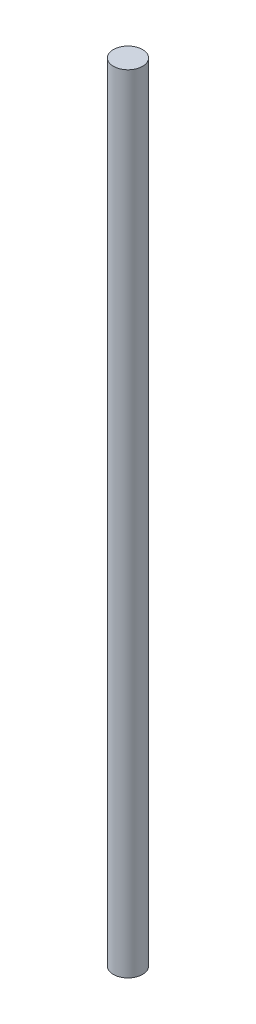
ISO-10303-21;
HEADER;
FILE_DESCRIPTION(('STEP AP214'),'2;1');
FILE_NAME('part.step','',(''),(''),'','','');
FILE_SCHEMA(('AUTOMOTIVE_DESIGN { 1 0 10303 214 1 1 1 1 }'));
ENDSEC;
DATA;
#1=APPLICATION_CONTEXT('core data for automotive mechanical design processes');
#2=APPLICATION_PROTOCOL_DEFINITION('international standard','automotive_design',2000,#1);
#3=PRODUCT_CONTEXT('',#1,'mechanical');
#4=PRODUCT('Part','Part','',(#3));
#5=PRODUCT_RELATED_PRODUCT_CATEGORY('part','',(#4));
#6=PRODUCT_DEFINITION_FORMATION('','',#4);
#7=PRODUCT_DEFINITION_CONTEXT('part definition',#1,'design');
#8=PRODUCT_DEFINITION('design','',#6,#7);
#9=PRODUCT_DEFINITION_SHAPE('','',#8);
#10=(LENGTH_UNIT() NAMED_UNIT(*) SI_UNIT(.MILLI.,.METRE.));
#11=(NAMED_UNIT(*) PLANE_ANGLE_UNIT() SI_UNIT($,.RADIAN.));
#12=(NAMED_UNIT(*) SI_UNIT($,.STERADIAN.) SOLID_ANGLE_UNIT());
#13=UNCERTAINTY_MEASURE_WITH_UNIT(LENGTH_MEASURE(1.E-05),#10,'distance_accuracy_value','');
#14=(GEOMETRIC_REPRESENTATION_CONTEXT(3) GLOBAL_UNCERTAINTY_ASSIGNED_CONTEXT((#13)) GLOBAL_UNIT_ASSIGNED_CONTEXT((#10,
#11,#12)) REPRESENTATION_CONTEXT('',''));
#15=CARTESIAN_POINT('',(0.,0.,0.));
#16=DIRECTION('',(0.,0.,1.));
#17=DIRECTION('',(1.,0.,0.));
#18=AXIS2_PLACEMENT_3D('',#15,#16,#17);
#19=CARTESIAN_POINT('',(0.,108.,0.));
#20=DIRECTION('',(0.,-1.,0.));
#21=DIRECTION('',(0.,0.,-1.));
#22=AXIS2_PLACEMENT_3D('',#19,#20,#21);
#23=CYLINDRICAL_SURFACE('',#22,2.);
#24=CARTESIAN_POINT('',(0.,108.,0.));
#25=DIRECTION('',(0.,1.,0.));
#26=DIRECTION('',(0.,0.,1.));
#27=AXIS2_PLACEMENT_3D('',#24,#25,#26);
#28=CIRCLE('',#27,2.);
#29=CARTESIAN_POINT('',(0.,108.,2.));
#30=VERTEX_POINT('',#29);
#31=EDGE_CURVE('E10',#30,#30,#28,.T.);
#32=ORIENTED_EDGE('',*,*,#31,.F.);
#33=EDGE_LOOP('',(#32));
#34=FACE_BOUND('',#33,.T.);
#35=CARTESIAN_POINT('',(0.,0.,0.));
#36=DIRECTION('',(0.,1.,0.));
#37=DIRECTION('',(0.,0.,1.));
#38=AXIS2_PLACEMENT_3D('',#35,#36,#37);
#39=CIRCLE('',#38,2.);
#40=CARTESIAN_POINT('',(0.,0.,2.));
#41=VERTEX_POINT('',#40);
#42=EDGE_CURVE('E35',#41,#41,#39,.T.);
#43=ORIENTED_EDGE('',*,*,#42,.T.);
#44=EDGE_LOOP('',(#43));
#45=FACE_BOUND('',#44,.T.);
#46=ADVANCED_FACE('F32',(#34,#45),#23,.T.);
#47=CARTESIAN_POINT('',(0.,108.,0.));
#48=DIRECTION('',(0.,1.,0.));
#49=DIRECTION('',(0.,0.,1.));
#50=AXIS2_PLACEMENT_3D('',#47,#48,#49);
#51=PLANE('',#50);
#52=ORIENTED_EDGE('',*,*,#31,.T.);
#53=EDGE_LOOP('',(#52));
#54=FACE_BOUND('',#53,.T.);
#55=ADVANCED_FACE('F47',(#54),#51,.T.);
#56=CARTESIAN_POINT('',(0.,0.,0.));
#57=DIRECTION('',(0.,1.,0.));
#58=DIRECTION('',(0.,0.,1.));
#59=AXIS2_PLACEMENT_3D('',#56,#57,#58);
#60=PLANE('',#59);
#61=ORIENTED_EDGE('',*,*,#42,.F.);
#62=EDGE_LOOP('',(#61));
#63=FACE_BOUND('',#62,.T.);
#64=ADVANCED_FACE('F45',(#63),#60,.F.);
#65=CLOSED_SHELL('',(#46,#55,#64));
#66=MANIFOLD_SOLID_BREP('B2',#65);
#67=ADVANCED_BREP_SHAPE_REPRESENTATION('',(#18,#66),#14);
#68=SHAPE_DEFINITION_REPRESENTATION(#9,#67);
ENDSEC;
END-ISO-10303-21;
